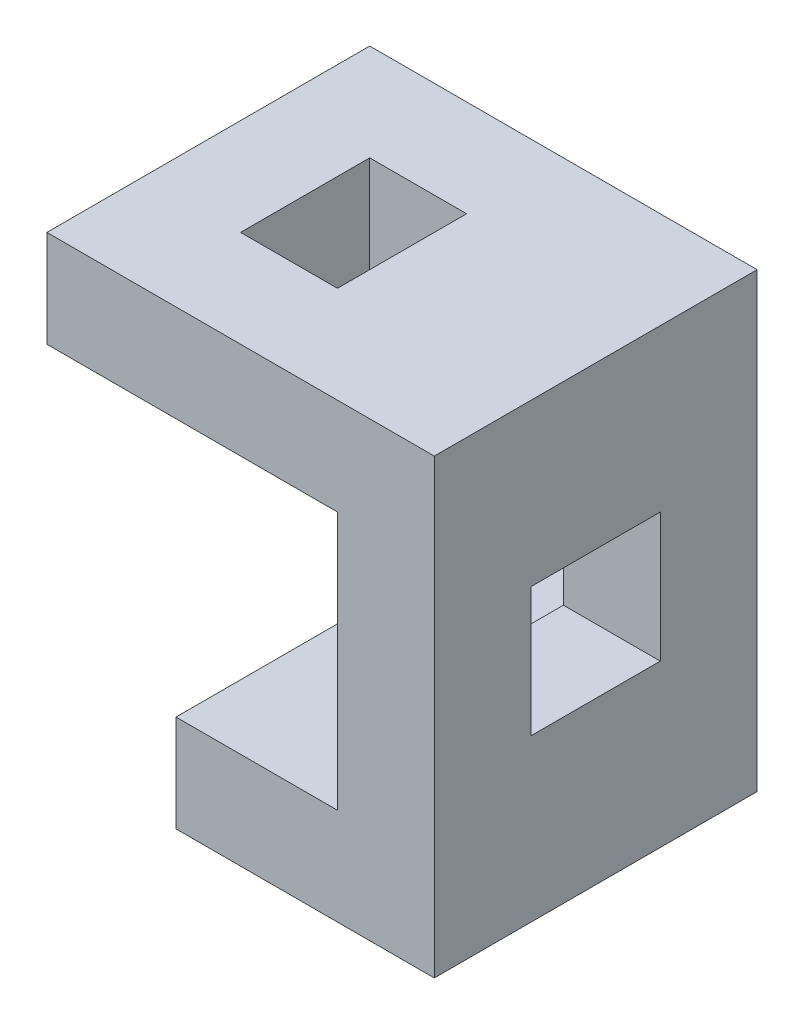
ISO-10303-21;
HEADER;
FILE_DESCRIPTION(('STEP AP214'),'2;1');
FILE_NAME('part.step','',(''),(''),'','','');
FILE_SCHEMA(('AUTOMOTIVE_DESIGN { 1 0 10303 214 1 1 1 1 }'));
ENDSEC;
DATA;
#1=APPLICATION_CONTEXT('core data for automotive mechanical design processes');
#2=APPLICATION_PROTOCOL_DEFINITION('international standard','automotive_design',2000,#1);
#3=PRODUCT_CONTEXT('',#1,'mechanical');
#4=PRODUCT('Part','Part','',(#3));
#5=PRODUCT_RELATED_PRODUCT_CATEGORY('part','',(#4));
#6=PRODUCT_DEFINITION_FORMATION('','',#4);
#7=PRODUCT_DEFINITION_CONTEXT('part definition',#1,'design');
#8=PRODUCT_DEFINITION('design','',#6,#7);
#9=PRODUCT_DEFINITION_SHAPE('','',#8);
#10=(LENGTH_UNIT() NAMED_UNIT(*) SI_UNIT(.MILLI.,.METRE.));
#11=(NAMED_UNIT(*) PLANE_ANGLE_UNIT() SI_UNIT($,.RADIAN.));
#12=(NAMED_UNIT(*) SI_UNIT($,.STERADIAN.) SOLID_ANGLE_UNIT());
#13=UNCERTAINTY_MEASURE_WITH_UNIT(LENGTH_MEASURE(1.E-05),#10,'distance_accuracy_value','');
#14=(GEOMETRIC_REPRESENTATION_CONTEXT(3) GLOBAL_UNCERTAINTY_ASSIGNED_CONTEXT((#13)) GLOBAL_UNIT_ASSIGNED_CONTEXT((#10,
#11,#12)) REPRESENTATION_CONTEXT('',''));
#15=CARTESIAN_POINT('',(0.,0.,0.));
#16=DIRECTION('',(0.,0.,1.));
#17=DIRECTION('',(1.,0.,0.));
#18=AXIS2_PLACEMENT_3D('',#15,#16,#17);
#19=CARTESIAN_POINT('',(-15.,15.,50.));
#20=DIRECTION('',(1.,0.,0.));
#21=DIRECTION('',(0.,1.,0.));
#22=AXIS2_PLACEMENT_3D('',#19,#20,#21);
#23=PLANE('',#22);
#24=DIRECTION('',(0.,-1.,0.));
#25=VECTOR('',#24,1.);
#26=CARTESIAN_POINT('',(-15.,15.,0.));
#27=LINE('',#26,#25);
#28=CARTESIAN_POINT('',(-15.,55.,0.));
#29=VERTEX_POINT('',#28);
#30=CARTESIAN_POINT('',(-15.,15.,0.));
#31=VERTEX_POINT('',#30);
#32=EDGE_CURVE('E238',#29,#31,#27,.T.);
#33=ORIENTED_EDGE('',*,*,#32,.T.);
#34=DIRECTION('',(0.,0.,-1.));
#35=VECTOR('',#34,1.);
#36=CARTESIAN_POINT('',(-15.,15.,50.));
#37=LINE('',#36,#35);
#38=CARTESIAN_POINT('',(-15.,15.,50.));
#39=VERTEX_POINT('',#38);
#40=EDGE_CURVE('E263',#39,#31,#37,.T.);
#41=ORIENTED_EDGE('',*,*,#40,.F.);
#42=DIRECTION('',(0.,-1.,0.));
#43=VECTOR('',#42,1.);
#44=CARTESIAN_POINT('',(-15.,15.,50.));
#45=LINE('',#44,#43);
#46=CARTESIAN_POINT('',(-15.,55.,50.));
#47=VERTEX_POINT('',#46);
#48=EDGE_CURVE('E221',#47,#39,#45,.T.);
#49=ORIENTED_EDGE('',*,*,#48,.F.);
#50=DIRECTION('',(0.,0.,-1.));
#51=VECTOR('',#50,1.);
#52=CARTESIAN_POINT('',(-15.,55.,50.));
#53=LINE('',#52,#51);
#54=EDGE_CURVE('E41',#47,#29,#53,.T.);
#55=ORIENTED_EDGE('',*,*,#54,.T.);
#56=EDGE_LOOP('',(#33,#41,#49,#55));
#57=FACE_BOUND('',#56,.T.);
#58=DIRECTION('',(0.,0.,1.));
#59=VECTOR('',#58,1.);
#60=CARTESIAN_POINT('',(-15.,25.,50.));
#61=LINE('',#60,#59);
#62=CARTESIAN_POINT('',(-15.,25.,15.));
#63=VERTEX_POINT('',#62);
#64=CARTESIAN_POINT('',(-15.,25.,35.));
#65=VERTEX_POINT('',#64);
#66=EDGE_CURVE('E212',#63,#65,#61,.T.);
#67=ORIENTED_EDGE('',*,*,#66,.F.);
#68=DIRECTION('',(0.,-1.,0.));
#69=VECTOR('',#68,1.);
#70=CARTESIAN_POINT('',(-15.,15.,15.));
#71=LINE('',#70,#69);
#72=CARTESIAN_POINT('',(-15.,45.,15.));
#73=VERTEX_POINT('',#72);
#74=EDGE_CURVE('E204',#73,#63,#71,.T.);
#75=ORIENTED_EDGE('',*,*,#74,.F.);
#76=DIRECTION('',(0.,0.,1.));
#77=VECTOR('',#76,1.);
#78=CARTESIAN_POINT('',(-15.,45.,50.));
#79=LINE('',#78,#77);
#80=CARTESIAN_POINT('',(-15.,45.,35.));
#81=VERTEX_POINT('',#80);
#82=EDGE_CURVE('E206',#73,#81,#79,.T.);
#83=ORIENTED_EDGE('',*,*,#82,.T.);
#84=DIRECTION('',(0.,-1.,0.));
#85=VECTOR('',#84,1.);
#86=CARTESIAN_POINT('',(-15.,15.,35.));
#87=LINE('',#86,#85);
#88=EDGE_CURVE('E209',#81,#65,#87,.T.);
#89=ORIENTED_EDGE('',*,*,#88,.T.);
#90=EDGE_LOOP('',(#67,#75,#83,#89));
#91=FACE_BOUND('',#90,.T.);
#92=ADVANCED_FACE('F33',(#57,#91),#23,.F.);
#93=CARTESIAN_POINT('',(0.,70.,50.));
#94=DIRECTION('',(-1.,0.,0.));
#95=DIRECTION('',(0.,0.,1.));
#96=AXIS2_PLACEMENT_3D('',#93,#94,#95);
#97=PLANE('',#96);
#98=DIRECTION('',(0.,1.,0.));
#99=VECTOR('',#98,1.);
#100=CARTESIAN_POINT('',(0.,70.,0.));
#101=LINE('',#100,#99);
#102=CARTESIAN_POINT('',(0.,0.,0.));
#103=VERTEX_POINT('',#102);
#104=CARTESIAN_POINT('',(0.,70.,0.));
#105=VERTEX_POINT('',#104);
#106=EDGE_CURVE('E246',#103,#105,#101,.T.);
#107=ORIENTED_EDGE('',*,*,#106,.T.);
#108=DIRECTION('',(0.,0.,-1.));
#109=VECTOR('',#108,1.);
#110=CARTESIAN_POINT('',(0.,70.,50.));
#111=LINE('',#110,#109);
#112=CARTESIAN_POINT('',(0.,70.,50.));
#113=VERTEX_POINT('',#112);
#114=EDGE_CURVE('E251',#113,#105,#111,.T.);
#115=ORIENTED_EDGE('',*,*,#114,.F.);
#116=DIRECTION('',(0.,1.,0.));
#117=VECTOR('',#116,1.);
#118=CARTESIAN_POINT('',(0.,70.,50.));
#119=LINE('',#118,#117);
#120=CARTESIAN_POINT('',(0.,0.,50.));
#121=VERTEX_POINT('',#120);
#122=EDGE_CURVE('E229',#121,#113,#119,.T.);
#123=ORIENTED_EDGE('',*,*,#122,.F.);
#124=DIRECTION('',(0.,0.,-1.));
#125=VECTOR('',#124,1.);
#126=CARTESIAN_POINT('',(0.,0.,50.));
#127=LINE('',#126,#125);
#128=EDGE_CURVE('E254',#121,#103,#127,.T.);
#129=ORIENTED_EDGE('',*,*,#128,.T.);
#130=EDGE_LOOP('',(#107,#115,#123,#129));
#131=FACE_BOUND('',#130,.T.);
#132=DIRECTION('',(0.,0.,1.));
#133=VECTOR('',#132,1.);
#134=CARTESIAN_POINT('',(0.,25.,15.));
#135=LINE('',#134,#133);
#136=CARTESIAN_POINT('',(0.,25.,15.));
#137=VERTEX_POINT('',#136);
#138=CARTESIAN_POINT('',(0.,25.,35.));
#139=VERTEX_POINT('',#138);
#140=EDGE_CURVE('E183',#137,#139,#135,.T.);
#141=ORIENTED_EDGE('',*,*,#140,.T.);
#142=DIRECTION('',(0.,-1.,0.));
#143=VECTOR('',#142,1.);
#144=CARTESIAN_POINT('',(0.,45.,35.));
#145=LINE('',#144,#143);
#146=CARTESIAN_POINT('',(0.,45.,35.));
#147=VERTEX_POINT('',#146);
#148=EDGE_CURVE('E186',#147,#139,#145,.T.);
#149=ORIENTED_EDGE('',*,*,#148,.F.);
#150=DIRECTION('',(0.,0.,1.));
#151=VECTOR('',#150,1.);
#152=CARTESIAN_POINT('',(0.,45.,15.));
#153=LINE('',#152,#151);
#154=CARTESIAN_POINT('',(0.,45.,15.));
#155=VERTEX_POINT('',#154);
#156=EDGE_CURVE('E189',#155,#147,#153,.T.);
#157=ORIENTED_EDGE('',*,*,#156,.F.);
#158=DIRECTION('',(0.,-1.,0.));
#159=VECTOR('',#158,1.);
#160=CARTESIAN_POINT('',(0.,45.,15.));
#161=LINE('',#160,#159);
#162=EDGE_CURVE('E192',#155,#137,#161,.T.);
#163=ORIENTED_EDGE('',*,*,#162,.T.);
#164=EDGE_LOOP('',(#141,#149,#157,#163));
#165=FACE_BOUND('',#164,.T.);
#166=ADVANCED_FACE('F302',(#131,#165),#97,.F.);
#167=CARTESIAN_POINT('',(-60.,70.,50.));
#168=DIRECTION('',(1.,0.,0.));
#169=DIRECTION('',(0.,1.,0.));
#170=AXIS2_PLACEMENT_3D('',#167,#168,#169);
#171=PLANE('',#170);
#172=DIRECTION('',(0.,-1.,0.));
#173=VECTOR('',#172,1.);
#174=CARTESIAN_POINT('',(-60.,70.,0.));
#175=LINE('',#174,#173);
#176=CARTESIAN_POINT('',(-60.,70.,0.));
#177=VERTEX_POINT('',#176);
#178=CARTESIAN_POINT('',(-60.,55.,0.));
#179=VERTEX_POINT('',#178);
#180=EDGE_CURVE('E214',#177,#179,#175,.T.);
#181=ORIENTED_EDGE('',*,*,#180,.T.);
#182=DIRECTION('',(0.,0.,-1.));
#183=VECTOR('',#182,1.);
#184=CARTESIAN_POINT('',(-60.,55.,50.));
#185=LINE('',#184,#183);
#186=CARTESIAN_POINT('',(-60.,55.,50.));
#187=VERTEX_POINT('',#186);
#188=EDGE_CURVE('E11',#187,#179,#185,.T.);
#189=ORIENTED_EDGE('',*,*,#188,.F.);
#190=DIRECTION('',(0.,-1.,0.));
#191=VECTOR('',#190,1.);
#192=CARTESIAN_POINT('',(-60.,70.,50.));
#193=LINE('',#192,#191);
#194=CARTESIAN_POINT('',(-60.,70.,50.));
#195=VERTEX_POINT('',#194);
#196=EDGE_CURVE('E215',#195,#187,#193,.T.);
#197=ORIENTED_EDGE('',*,*,#196,.F.);
#198=DIRECTION('',(0.,0.,-1.));
#199=VECTOR('',#198,1.);
#200=CARTESIAN_POINT('',(-60.,70.,50.));
#201=LINE('',#200,#199);
#202=EDGE_CURVE('E233',#195,#177,#201,.T.);
#203=ORIENTED_EDGE('',*,*,#202,.T.);
#204=EDGE_LOOP('',(#181,#189,#197,#203));
#205=FACE_BOUND('',#204,.T.);
#206=ADVANCED_FACE('F35',(#205),#171,.F.);
#207=CARTESIAN_POINT('',(-15.,55.,50.));
#208=DIRECTION('',(0.,1.,0.));
#209=DIRECTION('',(-1.,0.,0.));
#210=AXIS2_PLACEMENT_3D('',#207,#208,#209);
#211=PLANE('',#210);
#212=DIRECTION('',(-1.,0.,0.));
#213=VECTOR('',#212,1.);
#214=CARTESIAN_POINT('',(-15.,55.,15.));
#215=LINE('',#214,#213);
#216=CARTESIAN_POINT('',(-30.,55.,15.));
#217=VERTEX_POINT('',#216);
#218=CARTESIAN_POINT('',(-45.,55.,15.));
#219=VERTEX_POINT('',#218);
#220=EDGE_CURVE('E177',#217,#219,#215,.T.);
#221=ORIENTED_EDGE('',*,*,#220,.T.);
#222=DIRECTION('',(0.,0.,1.));
#223=VECTOR('',#222,1.);
#224=CARTESIAN_POINT('',(-45.,55.,50.));
#225=LINE('',#224,#223);
#226=CARTESIAN_POINT('',(-45.,55.,35.));
#227=VERTEX_POINT('',#226);
#228=EDGE_CURVE('E180',#219,#227,#225,.T.);
#229=ORIENTED_EDGE('',*,*,#228,.T.);
#230=DIRECTION('',(1.,0.,0.));
#231=VECTOR('',#230,1.);
#232=CARTESIAN_POINT('',(-15.,55.,35.));
#233=LINE('',#232,#231);
#234=CARTESIAN_POINT('',(-30.,55.,35.));
#235=VERTEX_POINT('',#234);
#236=EDGE_CURVE('E172',#227,#235,#233,.T.);
#237=ORIENTED_EDGE('',*,*,#236,.T.);
#238=DIRECTION('',(0.,0.,-1.));
#239=VECTOR('',#238,1.);
#240=CARTESIAN_POINT('',(-30.,55.,50.));
#241=LINE('',#240,#239);
#242=EDGE_CURVE('E152',#235,#217,#241,.T.);
#243=ORIENTED_EDGE('',*,*,#242,.T.);
#244=EDGE_LOOP('',(#221,#229,#237,#243));
#245=FACE_BOUND('',#244,.T.);
#246=DIRECTION('',(1.,0.,0.));
#247=VECTOR('',#246,1.);
#248=CARTESIAN_POINT('',(-15.,55.,0.));
#249=LINE('',#248,#247);
#250=EDGE_CURVE('E236',#179,#29,#249,.T.);
#251=ORIENTED_EDGE('',*,*,#250,.T.);
#252=ORIENTED_EDGE('',*,*,#54,.F.);
#253=DIRECTION('',(1.,0.,0.));
#254=VECTOR('',#253,1.);
#255=CARTESIAN_POINT('',(-15.,55.,50.));
#256=LINE('',#255,#254);
#257=EDGE_CURVE('E218',#187,#47,#256,.T.);
#258=ORIENTED_EDGE('',*,*,#257,.F.);
#259=ORIENTED_EDGE('',*,*,#188,.T.);
#260=EDGE_LOOP('',(#251,#252,#258,#259));
#261=FACE_BOUND('',#260,.T.);
#262=ADVANCED_FACE('F293',(#245,#261),#211,.F.);
#263=CARTESIAN_POINT('',(-40.,15.,50.));
#264=DIRECTION('',(0.,-1.,0.));
#265=DIRECTION('',(0.,0.,-1.));
#266=AXIS2_PLACEMENT_3D('',#263,#264,#265);
#267=PLANE('',#266);
#268=DIRECTION('',(-1.,0.,0.));
#269=VECTOR('',#268,1.);
#270=CARTESIAN_POINT('',(-40.,15.,0.));
#271=LINE('',#270,#269);
#272=CARTESIAN_POINT('',(-40.,15.,0.));
#273=VERTEX_POINT('',#272);
#274=EDGE_CURVE('E240',#31,#273,#271,.T.);
#275=ORIENTED_EDGE('',*,*,#274,.T.);
#276=DIRECTION('',(0.,0.,-1.));
#277=VECTOR('',#276,1.);
#278=CARTESIAN_POINT('',(-40.,15.,50.));
#279=LINE('',#278,#277);
#280=CARTESIAN_POINT('',(-40.,15.,50.));
#281=VERTEX_POINT('',#280);
#282=EDGE_CURVE('E260',#281,#273,#279,.T.);
#283=ORIENTED_EDGE('',*,*,#282,.F.);
#284=DIRECTION('',(-1.,0.,0.));
#285=VECTOR('',#284,1.);
#286=CARTESIAN_POINT('',(-40.,15.,50.));
#287=LINE('',#286,#285);
#288=EDGE_CURVE('E223',#39,#281,#287,.T.);
#289=ORIENTED_EDGE('',*,*,#288,.F.);
#290=ORIENTED_EDGE('',*,*,#40,.T.);
#291=EDGE_LOOP('',(#275,#283,#289,#290));
#292=FACE_BOUND('',#291,.T.);
#293=ADVANCED_FACE('F281',(#292),#267,.F.);
#294=CARTESIAN_POINT('',(-40.,0.,50.));
#295=DIRECTION('',(1.,0.,0.));
#296=DIRECTION('',(0.,0.,-1.));
#297=AXIS2_PLACEMENT_3D('',#294,#295,#296);
#298=PLANE('',#297);
#299=DIRECTION('',(0.,-1.,0.));
#300=VECTOR('',#299,1.);
#301=CARTESIAN_POINT('',(-40.,0.,0.));
#302=LINE('',#301,#300);
#303=CARTESIAN_POINT('',(-40.,0.,0.));
#304=VERTEX_POINT('',#303);
#305=EDGE_CURVE('E242',#273,#304,#302,.T.);
#306=ORIENTED_EDGE('',*,*,#305,.T.);
#307=DIRECTION('',(0.,0.,-1.));
#308=VECTOR('',#307,1.);
#309=CARTESIAN_POINT('',(-40.,0.,50.));
#310=LINE('',#309,#308);
#311=CARTESIAN_POINT('',(-40.,0.,50.));
#312=VERTEX_POINT('',#311);
#313=EDGE_CURVE('E257',#312,#304,#310,.T.);
#314=ORIENTED_EDGE('',*,*,#313,.F.);
#315=DIRECTION('',(0.,-1.,0.));
#316=VECTOR('',#315,1.);
#317=CARTESIAN_POINT('',(-40.,0.,50.));
#318=LINE('',#317,#316);
#319=EDGE_CURVE('E225',#281,#312,#318,.T.);
#320=ORIENTED_EDGE('',*,*,#319,.F.);
#321=ORIENTED_EDGE('',*,*,#282,.T.);
#322=EDGE_LOOP('',(#306,#314,#320,#321));
#323=FACE_BOUND('',#322,.T.);
#324=ADVANCED_FACE('F285',(#323),#298,.F.);
#325=CARTESIAN_POINT('',(0.,0.,50.));
#326=DIRECTION('',(0.,1.,0.));
#327=DIRECTION('',(-1.,0.,0.));
#328=AXIS2_PLACEMENT_3D('',#325,#326,#327);
#329=PLANE('',#328);
#330=DIRECTION('',(1.,0.,0.));
#331=VECTOR('',#330,1.);
#332=CARTESIAN_POINT('',(0.,0.,0.));
#333=LINE('',#332,#331);
#334=EDGE_CURVE('E244',#304,#103,#333,.T.);
#335=ORIENTED_EDGE('',*,*,#334,.T.);
#336=ORIENTED_EDGE('',*,*,#128,.F.);
#337=DIRECTION('',(1.,0.,0.));
#338=VECTOR('',#337,1.);
#339=CARTESIAN_POINT('',(0.,0.,50.));
#340=LINE('',#339,#338);
#341=EDGE_CURVE('E227',#312,#121,#340,.T.);
#342=ORIENTED_EDGE('',*,*,#341,.F.);
#343=ORIENTED_EDGE('',*,*,#313,.T.);
#344=EDGE_LOOP('',(#335,#336,#342,#343));
#345=FACE_BOUND('',#344,.T.);
#346=ADVANCED_FACE('F305',(#345),#329,.F.);
#347=CARTESIAN_POINT('',(-60.,70.,50.));
#348=DIRECTION('',(0.,-1.,0.));
#349=DIRECTION('',(0.,0.,-1.));
#350=AXIS2_PLACEMENT_3D('',#347,#348,#349);
#351=PLANE('',#350);
#352=DIRECTION('',(1.,0.,0.));
#353=VECTOR('',#352,1.);
#354=CARTESIAN_POINT('',(-45.,70.,35.));
#355=LINE('',#354,#353);
#356=CARTESIAN_POINT('',(-45.,70.,35.));
#357=VERTEX_POINT('',#356);
#358=CARTESIAN_POINT('',(-30.,70.,35.));
#359=VERTEX_POINT('',#358);
#360=EDGE_CURVE('E158',#357,#359,#355,.T.);
#361=ORIENTED_EDGE('',*,*,#360,.F.);
#362=DIRECTION('',(0.,0.,1.));
#363=VECTOR('',#362,1.);
#364=CARTESIAN_POINT('',(-45.,70.,15.));
#365=LINE('',#364,#363);
#366=CARTESIAN_POINT('',(-45.,70.,15.));
#367=VERTEX_POINT('',#366);
#368=EDGE_CURVE('E56',#367,#357,#365,.T.);
#369=ORIENTED_EDGE('',*,*,#368,.F.);
#370=DIRECTION('',(-1.,0.,0.));
#371=VECTOR('',#370,1.);
#372=CARTESIAN_POINT('',(-45.,70.,15.));
#373=LINE('',#372,#371);
#374=CARTESIAN_POINT('',(-30.,70.,15.));
#375=VERTEX_POINT('',#374);
#376=EDGE_CURVE('E165',#375,#367,#373,.T.);
#377=ORIENTED_EDGE('',*,*,#376,.F.);
#378=DIRECTION('',(0.,0.,-1.));
#379=VECTOR('',#378,1.);
#380=CARTESIAN_POINT('',(-30.,70.,15.));
#381=LINE('',#380,#379);
#382=EDGE_CURVE('E149',#359,#375,#381,.T.);
#383=ORIENTED_EDGE('',*,*,#382,.F.);
#384=EDGE_LOOP('',(#361,#369,#377,#383));
#385=FACE_BOUND('',#384,.T.);
#386=DIRECTION('',(-1.,0.,0.));
#387=VECTOR('',#386,1.);
#388=CARTESIAN_POINT('',(-60.,70.,0.));
#389=LINE('',#388,#387);
#390=EDGE_CURVE('E219',#105,#177,#389,.T.);
#391=ORIENTED_EDGE('',*,*,#390,.T.);
#392=ORIENTED_EDGE('',*,*,#202,.F.);
#393=DIRECTION('',(-1.,0.,0.));
#394=VECTOR('',#393,1.);
#395=CARTESIAN_POINT('',(-60.,70.,50.));
#396=LINE('',#395,#394);
#397=EDGE_CURVE('E231',#113,#195,#396,.T.);
#398=ORIENTED_EDGE('',*,*,#397,.F.);
#399=ORIENTED_EDGE('',*,*,#114,.T.);
#400=EDGE_LOOP('',(#391,#392,#398,#399));
#401=FACE_BOUND('',#400,.T.);
#402=ADVANCED_FACE('F162',(#385,#401),#351,.F.);
#403=CARTESIAN_POINT('',(0.,0.,50.));
#404=DIRECTION('',(0.,0.,-1.));
#405=DIRECTION('',(-1.,0.,0.));
#406=AXIS2_PLACEMENT_3D('',#403,#404,#405);
#407=PLANE('',#406);
#408=ORIENTED_EDGE('',*,*,#196,.T.);
#409=ORIENTED_EDGE('',*,*,#257,.T.);
#410=ORIENTED_EDGE('',*,*,#48,.T.);
#411=ORIENTED_EDGE('',*,*,#288,.T.);
#412=ORIENTED_EDGE('',*,*,#319,.T.);
#413=ORIENTED_EDGE('',*,*,#341,.T.);
#414=ORIENTED_EDGE('',*,*,#122,.T.);
#415=ORIENTED_EDGE('',*,*,#397,.T.);
#416=EDGE_LOOP('',(#408,#409,#410,#411,#412,#413,#414,#415));
#417=FACE_BOUND('',#416,.T.);
#418=ADVANCED_FACE('F289',(#417),#407,.F.);
#419=CARTESIAN_POINT('',(0.,0.,0.));
#420=DIRECTION('',(0.,0.,-1.));
#421=DIRECTION('',(-1.,0.,0.));
#422=AXIS2_PLACEMENT_3D('',#419,#420,#421);
#423=PLANE('',#422);
#424=ORIENTED_EDGE('',*,*,#180,.F.);
#425=ORIENTED_EDGE('',*,*,#390,.F.);
#426=ORIENTED_EDGE('',*,*,#106,.F.);
#427=ORIENTED_EDGE('',*,*,#334,.F.);
#428=ORIENTED_EDGE('',*,*,#305,.F.);
#429=ORIENTED_EDGE('',*,*,#274,.F.);
#430=ORIENTED_EDGE('',*,*,#32,.F.);
#431=ORIENTED_EDGE('',*,*,#250,.F.);
#432=EDGE_LOOP('',(#424,#425,#426,#427,#428,#429,#430,#431));
#433=FACE_BOUND('',#432,.T.);
#434=ADVANCED_FACE('F276',(#433),#423,.T.);
#435=CARTESIAN_POINT('',(-50.,25.,15.));
#436=DIRECTION('',(0.,1.,0.));
#437=DIRECTION('',(0.,0.,1.));
#438=AXIS2_PLACEMENT_3D('',#435,#436,#437);
#439=PLANE('',#438);
#440=ORIENTED_EDGE('',*,*,#66,.T.);
#441=DIRECTION('',(1.,0.,0.));
#442=VECTOR('',#441,1.);
#443=CARTESIAN_POINT('',(-50.,25.,35.));
#444=LINE('',#443,#442);
#445=EDGE_CURVE('E202',#65,#139,#444,.T.);
#446=ORIENTED_EDGE('',*,*,#445,.T.);
#447=ORIENTED_EDGE('',*,*,#140,.F.);
#448=DIRECTION('',(1.,0.,0.));
#449=VECTOR('',#448,1.);
#450=CARTESIAN_POINT('',(-50.,25.,15.));
#451=LINE('',#450,#449);
#452=EDGE_CURVE('E195',#63,#137,#451,.T.);
#453=ORIENTED_EDGE('',*,*,#452,.F.);
#454=EDGE_LOOP('',(#440,#446,#447,#453));
#455=FACE_BOUND('',#454,.T.);
#456=ADVANCED_FACE('F351',(#455),#439,.T.);
#457=CARTESIAN_POINT('',(-50.,45.,35.));
#458=DIRECTION('',(0.,0.,1.));
#459=DIRECTION('',(0.,-1.,0.));
#460=AXIS2_PLACEMENT_3D('',#457,#458,#459);
#461=PLANE('',#460);
#462=DIRECTION('',(1.,0.,0.));
#463=VECTOR('',#462,1.);
#464=CARTESIAN_POINT('',(-50.,45.,35.));
#465=LINE('',#464,#463);
#466=EDGE_CURVE('E200',#81,#147,#465,.T.);
#467=ORIENTED_EDGE('',*,*,#466,.T.);
#468=ORIENTED_EDGE('',*,*,#148,.T.);
#469=ORIENTED_EDGE('',*,*,#445,.F.);
#470=ORIENTED_EDGE('',*,*,#88,.F.);
#471=EDGE_LOOP('',(#467,#468,#469,#470));
#472=FACE_BOUND('',#471,.T.);
#473=ADVANCED_FACE('F347',(#472),#461,.F.);
#474=CARTESIAN_POINT('',(-50.,45.,15.));
#475=DIRECTION('',(0.,1.,0.));
#476=DIRECTION('',(0.,0.,1.));
#477=AXIS2_PLACEMENT_3D('',#474,#475,#476);
#478=PLANE('',#477);
#479=DIRECTION('',(1.,0.,0.));
#480=VECTOR('',#479,1.);
#481=CARTESIAN_POINT('',(-50.,45.,15.));
#482=LINE('',#481,#480);
#483=EDGE_CURVE('E198',#73,#155,#482,.T.);
#484=ORIENTED_EDGE('',*,*,#483,.T.);
#485=ORIENTED_EDGE('',*,*,#156,.T.);
#486=ORIENTED_EDGE('',*,*,#466,.F.);
#487=ORIENTED_EDGE('',*,*,#82,.F.);
#488=EDGE_LOOP('',(#484,#485,#486,#487));
#489=FACE_BOUND('',#488,.T.);
#490=ADVANCED_FACE('F339',(#489),#478,.F.);
#491=CARTESIAN_POINT('',(-50.,45.,15.));
#492=DIRECTION('',(0.,0.,1.));
#493=DIRECTION('',(0.,-1.,0.));
#494=AXIS2_PLACEMENT_3D('',#491,#492,#493);
#495=PLANE('',#494);
#496=ORIENTED_EDGE('',*,*,#74,.T.);
#497=ORIENTED_EDGE('',*,*,#452,.T.);
#498=ORIENTED_EDGE('',*,*,#162,.F.);
#499=ORIENTED_EDGE('',*,*,#483,.F.);
#500=EDGE_LOOP('',(#496,#497,#498,#499));
#501=FACE_BOUND('',#500,.T.);
#502=ADVANCED_FACE('F332',(#501),#495,.T.);
#503=CARTESIAN_POINT('',(-45.,20.,15.));
#504=DIRECTION('',(-1.,0.,0.));
#505=DIRECTION('',(0.,0.,1.));
#506=AXIS2_PLACEMENT_3D('',#503,#504,#505);
#507=PLANE('',#506);
#508=DIRECTION('',(0.,1.,0.));
#509=VECTOR('',#508,1.);
#510=CARTESIAN_POINT('',(-45.,20.,15.));
#511=LINE('',#510,#509);
#512=EDGE_CURVE('E170',#219,#367,#511,.T.);
#513=ORIENTED_EDGE('',*,*,#512,.T.);
#514=ORIENTED_EDGE('',*,*,#368,.T.);
#515=DIRECTION('',(0.,1.,0.));
#516=VECTOR('',#515,1.);
#517=CARTESIAN_POINT('',(-45.,20.,35.));
#518=LINE('',#517,#516);
#519=EDGE_CURVE('E155',#227,#357,#518,.T.);
#520=ORIENTED_EDGE('',*,*,#519,.F.);
#521=ORIENTED_EDGE('',*,*,#228,.F.);
#522=EDGE_LOOP('',(#513,#514,#520,#521));
#523=FACE_BOUND('',#522,.T.);
#524=ADVANCED_FACE('F330',(#523),#507,.F.);
#525=CARTESIAN_POINT('',(-45.,20.,15.));
#526=DIRECTION('',(0.,0.,-1.));
#527=DIRECTION('',(-1.,0.,0.));
#528=AXIS2_PLACEMENT_3D('',#525,#526,#527);
#529=PLANE('',#528);
#530=DIRECTION('',(0.,1.,0.));
#531=VECTOR('',#530,1.);
#532=CARTESIAN_POINT('',(-30.,20.,15.));
#533=LINE('',#532,#531);
#534=EDGE_CURVE('E154',#217,#375,#533,.T.);
#535=ORIENTED_EDGE('',*,*,#534,.T.);
#536=ORIENTED_EDGE('',*,*,#376,.T.);
#537=ORIENTED_EDGE('',*,*,#512,.F.);
#538=ORIENTED_EDGE('',*,*,#220,.F.);
#539=EDGE_LOOP('',(#535,#536,#537,#538));
#540=FACE_BOUND('',#539,.T.);
#541=ADVANCED_FACE('F329',(#540),#529,.F.);
#542=CARTESIAN_POINT('',(-30.,20.,15.));
#543=DIRECTION('',(1.,0.,0.));
#544=DIRECTION('',(0.,0.,-1.));
#545=AXIS2_PLACEMENT_3D('',#542,#543,#544);
#546=PLANE('',#545);
#547=DIRECTION('',(0.,1.,0.));
#548=VECTOR('',#547,1.);
#549=CARTESIAN_POINT('',(-30.,20.,35.));
#550=LINE('',#549,#548);
#551=EDGE_CURVE('E48',#235,#359,#550,.T.);
#552=ORIENTED_EDGE('',*,*,#551,.T.);
#553=ORIENTED_EDGE('',*,*,#382,.T.);
#554=ORIENTED_EDGE('',*,*,#534,.F.);
#555=ORIENTED_EDGE('',*,*,#242,.F.);
#556=EDGE_LOOP('',(#552,#553,#554,#555));
#557=FACE_BOUND('',#556,.T.);
#558=ADVANCED_FACE('F146',(#557),#546,.F.);
#559=CARTESIAN_POINT('',(-45.,20.,35.));
#560=DIRECTION('',(0.,0.,1.));
#561=DIRECTION('',(1.,0.,0.));
#562=AXIS2_PLACEMENT_3D('',#559,#560,#561);
#563=PLANE('',#562);
#564=ORIENTED_EDGE('',*,*,#519,.T.);
#565=ORIENTED_EDGE('',*,*,#360,.T.);
#566=ORIENTED_EDGE('',*,*,#551,.F.);
#567=ORIENTED_EDGE('',*,*,#236,.F.);
#568=EDGE_LOOP('',(#564,#565,#566,#567));
#569=FACE_BOUND('',#568,.T.);
#570=ADVANCED_FACE('F159',(#569),#563,.F.);
#571=CLOSED_SHELL('',(#92,#166,#206,#262,#293,#324,#346,#402,#418,#434,#456,#473,#490,#502,#524,
#541,#558,#570));
#572=MANIFOLD_SOLID_BREP('B2',#571);
#573=ADVANCED_BREP_SHAPE_REPRESENTATION('',(#18,#572),#14);
#574=SHAPE_DEFINITION_REPRESENTATION(#9,#573);
ENDSEC;
END-ISO-10303-21;
